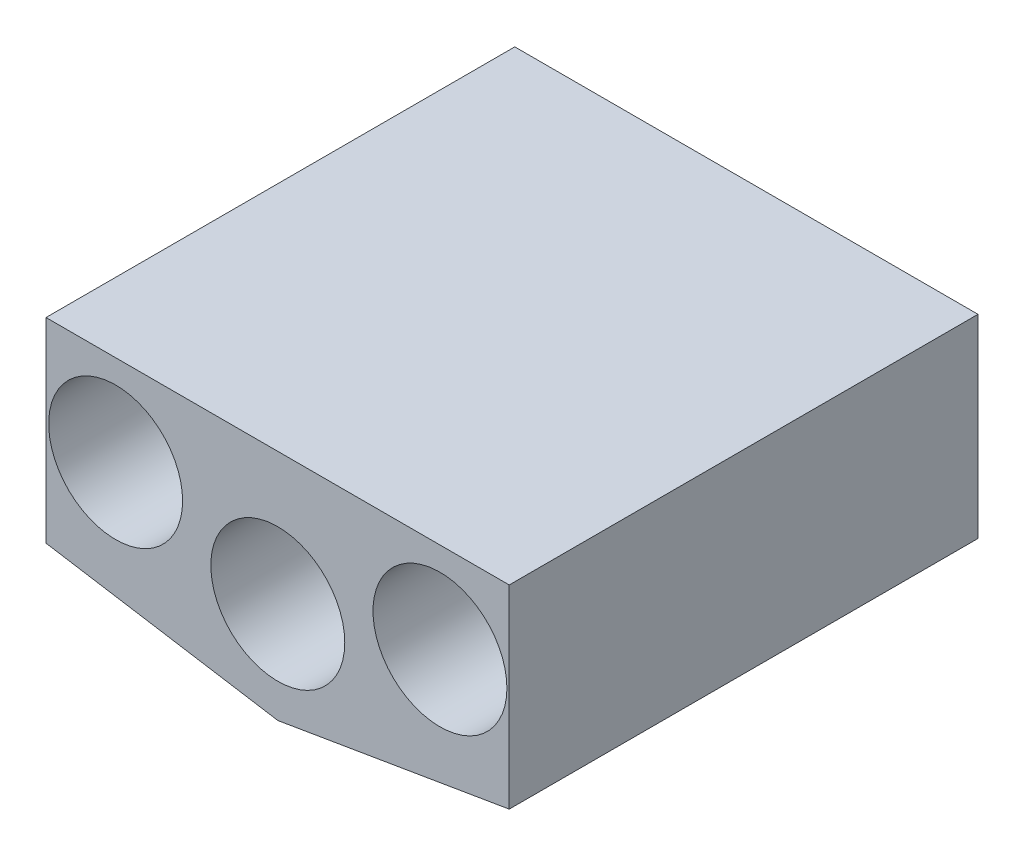
ISO-10303-21;
HEADER;
FILE_DESCRIPTION(('STEP AP214'),'2;1');
FILE_NAME('part.step','',(''),(''),'','','');
FILE_SCHEMA(('AUTOMOTIVE_DESIGN { 1 0 10303 214 1 1 1 1 }'));
ENDSEC;
DATA;
#1=APPLICATION_CONTEXT('core data for automotive mechanical design processes');
#2=APPLICATION_PROTOCOL_DEFINITION('international standard','automotive_design',2000,#1);
#3=PRODUCT_CONTEXT('',#1,'mechanical');
#4=PRODUCT('Part','Part','',(#3));
#5=PRODUCT_RELATED_PRODUCT_CATEGORY('part','',(#4));
#6=PRODUCT_DEFINITION_FORMATION('','',#4);
#7=PRODUCT_DEFINITION_CONTEXT('part definition',#1,'design');
#8=PRODUCT_DEFINITION('design','',#6,#7);
#9=PRODUCT_DEFINITION_SHAPE('','',#8);
#10=(LENGTH_UNIT() NAMED_UNIT(*) SI_UNIT(.MILLI.,.METRE.));
#11=(NAMED_UNIT(*) PLANE_ANGLE_UNIT() SI_UNIT($,.RADIAN.));
#12=(NAMED_UNIT(*) SI_UNIT($,.STERADIAN.) SOLID_ANGLE_UNIT());
#13=UNCERTAINTY_MEASURE_WITH_UNIT(LENGTH_MEASURE(1.E-05),#10,'distance_accuracy_value','');
#14=(GEOMETRIC_REPRESENTATION_CONTEXT(3) GLOBAL_UNCERTAINTY_ASSIGNED_CONTEXT((#13)) GLOBAL_UNIT_ASSIGNED_CONTEXT((#10,
#11,#12)) REPRESENTATION_CONTEXT('',''));
#15=CARTESIAN_POINT('',(0.,0.,0.));
#16=DIRECTION('',(0.,0.,1.));
#17=DIRECTION('',(1.,0.,0.));
#18=AXIS2_PLACEMENT_3D('',#15,#16,#17);
#19=CARTESIAN_POINT('',(0.,0.,70.));
#20=DIRECTION('',(0.,0.,1.));
#21=DIRECTION('',(1.,0.,0.));
#22=AXIS2_PLACEMENT_3D('',#19,#20,#21);
#23=PLANE('',#22);
#24=CARTESIAN_POINT('',(0.,0.,70.));
#25=DIRECTION('',(0.,0.,1.));
#26=DIRECTION('',(1.,0.,0.));
#27=AXIS2_PLACEMENT_3D('',#24,#25,#26);
#28=CIRCLE('',#27,10.);
#29=CARTESIAN_POINT('',(10.,0.,70.));
#30=VERTEX_POINT('',#29);
#31=EDGE_CURVE('E183',#30,#30,#28,.T.);
#32=ORIENTED_EDGE('',*,*,#31,.F.);
#33=EDGE_LOOP('',(#32));
#34=FACE_BOUND('',#33,.T.);
#35=DIRECTION('',(0.,1.,0.));
#36=VECTOR('',#35,1.);
#37=CARTESIAN_POINT('',(34.5580000783424,19.7407124290294,70.));
#38=LINE('',#37,#36);
#39=CARTESIAN_POINT('',(34.5580000783424,-9.25315364567469,70.));
#40=VERTEX_POINT('',#39);
#41=CARTESIAN_POINT('',(34.5580000783424,19.7407124290294,70.));
#42=VERTEX_POINT('',#41);
#43=EDGE_CURVE('E116',#40,#42,#38,.T.);
#44=ORIENTED_EDGE('',*,*,#43,.T.);
#45=DIRECTION('',(-1.,0.,0.));
#46=VECTOR('',#45,1.);
#47=CARTESIAN_POINT('',(-34.6119999216576,19.7407124290294,70.));
#48=LINE('',#47,#46);
#49=CARTESIAN_POINT('',(-34.6119999216576,19.7407124290294,70.));
#50=VERTEX_POINT('',#49);
#51=EDGE_CURVE('E83',#42,#50,#48,.T.);
#52=ORIENTED_EDGE('',*,*,#51,.T.);
#53=DIRECTION('',(0.,-1.,0.));
#54=VECTOR('',#53,1.);
#55=CARTESIAN_POINT('',(-34.6119999216576,-9.44415000475836,70.));
#56=LINE('',#55,#54);
#57=CARTESIAN_POINT('',(-34.6119999216576,-9.44415000475836,70.));
#58=VERTEX_POINT('',#57);
#59=EDGE_CURVE('E87',#50,#58,#56,.T.);
#60=ORIENTED_EDGE('',*,*,#59,.T.);
#61=DIRECTION('',(0.987066664055254,-0.16031032627636,0.));
#62=VECTOR('',#61,1.);
#63=CARTESIAN_POINT('',(-34.6119999216576,-9.44415000475836,70.));
#64=LINE('',#63,#62);
#65=CARTESIAN_POINT('',(0.0146025416581722,-15.0678856052803,70.));
#66=VERTEX_POINT('',#65);
#67=EDGE_CURVE('E91',#58,#66,#64,.T.);
#68=ORIENTED_EDGE('',*,*,#67,.T.);
#69=DIRECTION('',(0.98612644952598,0.165995860024531,0.));
#70=VECTOR('',#69,1.);
#71=CARTESIAN_POINT('',(34.5580000783424,-9.25315364567469,70.));
#72=LINE('',#71,#70);
#73=EDGE_CURVE('E49',#66,#40,#72,.T.);
#74=ORIENTED_EDGE('',*,*,#73,.T.);
#75=EDGE_LOOP('',(#44,#52,#60,#68,#74));
#76=FACE_BOUND('',#75,.T.);
#77=CARTESIAN_POINT('',(-24.2145790282158,6.21724717912147,70.));
#78=DIRECTION('',(0.,0.,1.));
#79=DIRECTION('',(1.,0.,0.));
#80=AXIS2_PLACEMENT_3D('',#77,#78,#79);
#81=CIRCLE('',#80,10.);
#82=CARTESIAN_POINT('',(-14.2145790282157,6.21724717912147,70.));
#83=VERTEX_POINT('',#82);
#84=EDGE_CURVE('E111',#83,#83,#81,.T.);
#85=ORIENTED_EDGE('',*,*,#84,.F.);
#86=EDGE_LOOP('',(#85));
#87=FACE_BOUND('',#86,.T.);
#88=CARTESIAN_POINT('',(24.2145790282158,6.21724717912114,70.));
#89=DIRECTION('',(0.,0.,1.));
#90=DIRECTION('',(1.,0.,0.));
#91=AXIS2_PLACEMENT_3D('',#88,#89,#90);
#92=CIRCLE('',#91,9.99999999999999);
#93=CARTESIAN_POINT('',(34.2145790282158,6.21724717912114,70.));
#94=VERTEX_POINT('',#93);
#95=EDGE_CURVE('E175',#94,#94,#92,.T.);
#96=ORIENTED_EDGE('',*,*,#95,.F.);
#97=EDGE_LOOP('',(#96));
#98=FACE_BOUND('',#97,.T.);
#99=ADVANCED_FACE('F32',(#34,#76,#87,#98),#23,.T.);
#100=CARTESIAN_POINT('',(0.,0.,0.));
#101=DIRECTION('',(0.,0.,1.));
#102=DIRECTION('',(1.,0.,0.));
#103=AXIS2_PLACEMENT_3D('',#100,#101,#102);
#104=PLANE('',#103);
#105=DIRECTION('',(0.,1.,0.));
#106=VECTOR('',#105,1.);
#107=CARTESIAN_POINT('',(34.5580000783424,19.7407124290294,0.));
#108=LINE('',#107,#106);
#109=CARTESIAN_POINT('',(34.5580000783424,-9.25315364567469,0.));
#110=VERTEX_POINT('',#109);
#111=CARTESIAN_POINT('',(34.5580000783424,19.7407124290294,0.));
#112=VERTEX_POINT('',#111);
#113=EDGE_CURVE('E107',#110,#112,#108,.T.);
#114=ORIENTED_EDGE('',*,*,#113,.F.);
#115=DIRECTION('',(0.98612644952598,0.165995860024531,0.));
#116=VECTOR('',#115,1.);
#117=CARTESIAN_POINT('',(34.5580000783424,-9.25315364567469,0.));
#118=LINE('',#117,#116);
#119=CARTESIAN_POINT('',(0.0146025416581722,-15.0678856052803,0.));
#120=VERTEX_POINT('',#119);
#121=EDGE_CURVE('E75',#120,#110,#118,.T.);
#122=ORIENTED_EDGE('',*,*,#121,.F.);
#123=DIRECTION('',(0.987066664055254,-0.16031032627636,0.));
#124=VECTOR('',#123,1.);
#125=CARTESIAN_POINT('',(-34.6119999216576,-9.44415000475836,0.));
#126=LINE('',#125,#124);
#127=CARTESIAN_POINT('',(-34.6119999216576,-9.44415000475836,0.));
#128=VERTEX_POINT('',#127);
#129=EDGE_CURVE('E69',#128,#120,#126,.T.);
#130=ORIENTED_EDGE('',*,*,#129,.F.);
#131=DIRECTION('',(0.,-1.,0.));
#132=VECTOR('',#131,1.);
#133=CARTESIAN_POINT('',(-34.6119999216576,-9.44415000475836,0.));
#134=LINE('',#133,#132);
#135=CARTESIAN_POINT('',(-34.6119999216576,19.7407124290294,0.));
#136=VERTEX_POINT('',#135);
#137=EDGE_CURVE('E98',#136,#128,#134,.T.);
#138=ORIENTED_EDGE('',*,*,#137,.F.);
#139=DIRECTION('',(-1.,0.,0.));
#140=VECTOR('',#139,1.);
#141=CARTESIAN_POINT('',(-34.6119999216576,19.7407124290294,0.));
#142=LINE('',#141,#140);
#143=EDGE_CURVE('E110',#112,#136,#142,.T.);
#144=ORIENTED_EDGE('',*,*,#143,.F.);
#145=EDGE_LOOP('',(#114,#122,#130,#138,#144));
#146=FACE_BOUND('',#145,.T.);
#147=CARTESIAN_POINT('',(-24.2145790282158,6.21724717912147,0.));
#148=DIRECTION('',(0.,0.,1.));
#149=DIRECTION('',(1.,0.,0.));
#150=AXIS2_PLACEMENT_3D('',#147,#148,#149);
#151=CIRCLE('',#150,10.);
#152=CARTESIAN_POINT('',(-14.2145790282157,6.21724717912147,0.));
#153=VERTEX_POINT('',#152);
#154=EDGE_CURVE('E186',#153,#153,#151,.T.);
#155=ORIENTED_EDGE('',*,*,#154,.T.);
#156=EDGE_LOOP('',(#155));
#157=FACE_BOUND('',#156,.T.);
#158=CARTESIAN_POINT('',(0.,0.,0.));
#159=DIRECTION('',(0.,0.,1.));
#160=DIRECTION('',(1.,0.,0.));
#161=AXIS2_PLACEMENT_3D('',#158,#159,#160);
#162=CIRCLE('',#161,10.);
#163=CARTESIAN_POINT('',(10.,0.,0.));
#164=VERTEX_POINT('',#163);
#165=EDGE_CURVE('E178',#164,#164,#162,.T.);
#166=ORIENTED_EDGE('',*,*,#165,.T.);
#167=EDGE_LOOP('',(#166));
#168=FACE_BOUND('',#167,.T.);
#169=CARTESIAN_POINT('',(24.2145790282158,6.21724717912114,0.));
#170=DIRECTION('',(0.,0.,1.));
#171=DIRECTION('',(1.,0.,0.));
#172=AXIS2_PLACEMENT_3D('',#169,#170,#171);
#173=CIRCLE('',#172,9.99999999999999);
#174=CARTESIAN_POINT('',(34.2145790282158,6.21724717912114,0.));
#175=VERTEX_POINT('',#174);
#176=EDGE_CURVE('E179',#175,#175,#173,.T.);
#177=ORIENTED_EDGE('',*,*,#176,.T.);
#178=EDGE_LOOP('',(#177));
#179=FACE_BOUND('',#178,.T.);
#180=ADVANCED_FACE('F120',(#146,#157,#168,#179),#104,.F.);
#181=CARTESIAN_POINT('',(34.5580000783424,19.7407124290294,70.));
#182=DIRECTION('',(-1.,0.,0.));
#183=DIRECTION('',(0.,0.,1.));
#184=AXIS2_PLACEMENT_3D('',#181,#182,#183);
#185=PLANE('',#184);
#186=ORIENTED_EDGE('',*,*,#113,.T.);
#187=DIRECTION('',(0.,0.,-1.));
#188=VECTOR('',#187,1.);
#189=CARTESIAN_POINT('',(34.5580000783424,19.7407124290294,70.));
#190=LINE('',#189,#188);
#191=EDGE_CURVE('E11',#42,#112,#190,.T.);
#192=ORIENTED_EDGE('',*,*,#191,.F.);
#193=ORIENTED_EDGE('',*,*,#43,.F.);
#194=DIRECTION('',(0.,0.,-1.));
#195=VECTOR('',#194,1.);
#196=CARTESIAN_POINT('',(34.5580000783424,-9.25315364567469,70.));
#197=LINE('',#196,#195);
#198=EDGE_CURVE('E103',#40,#110,#197,.T.);
#199=ORIENTED_EDGE('',*,*,#198,.T.);
#200=EDGE_LOOP('',(#186,#192,#193,#199));
#201=FACE_BOUND('',#200,.T.);
#202=ADVANCED_FACE('F34',(#201),#185,.F.);
#203=CARTESIAN_POINT('',(-34.6119999216576,19.7407124290294,70.));
#204=DIRECTION('',(0.,-1.,0.));
#205=DIRECTION('',(0.,0.,-1.));
#206=AXIS2_PLACEMENT_3D('',#203,#204,#205);
#207=PLANE('',#206);
#208=ORIENTED_EDGE('',*,*,#143,.T.);
#209=DIRECTION('',(0.,0.,-1.));
#210=VECTOR('',#209,1.);
#211=CARTESIAN_POINT('',(-34.6119999216576,19.7407124290294,70.));
#212=LINE('',#211,#210);
#213=EDGE_CURVE('E41',#50,#136,#212,.T.);
#214=ORIENTED_EDGE('',*,*,#213,.F.);
#215=ORIENTED_EDGE('',*,*,#51,.F.);
#216=ORIENTED_EDGE('',*,*,#191,.T.);
#217=EDGE_LOOP('',(#208,#214,#215,#216));
#218=FACE_BOUND('',#217,.T.);
#219=ADVANCED_FACE('F300',(#218),#207,.F.);
#220=CARTESIAN_POINT('',(-34.6119999216576,-9.44415000475836,70.));
#221=DIRECTION('',(1.,0.,0.));
#222=DIRECTION('',(0.,0.,-1.));
#223=AXIS2_PLACEMENT_3D('',#220,#221,#222);
#224=PLANE('',#223);
#225=ORIENTED_EDGE('',*,*,#137,.T.);
#226=DIRECTION('',(0.,0.,-1.));
#227=VECTOR('',#226,1.);
#228=CARTESIAN_POINT('',(-34.6119999216576,-9.44415000475836,70.));
#229=LINE('',#228,#227);
#230=EDGE_CURVE('E95',#58,#128,#229,.T.);
#231=ORIENTED_EDGE('',*,*,#230,.F.);
#232=ORIENTED_EDGE('',*,*,#59,.F.);
#233=ORIENTED_EDGE('',*,*,#213,.T.);
#234=EDGE_LOOP('',(#225,#231,#232,#233));
#235=FACE_BOUND('',#234,.T.);
#236=ADVANCED_FACE('F96',(#235),#224,.F.);
#237=CARTESIAN_POINT('',(-34.6119999216576,-9.44415000475836,70.));
#238=DIRECTION('',(0.16031032627636,0.987066664055254,0.));
#239=DIRECTION('',(-0.987066664055254,0.16031032627636,0.));
#240=AXIS2_PLACEMENT_3D('',#237,#238,#239);
#241=PLANE('',#240);
#242=CARTESIAN_POINT('',(-12.896533312442,-12.9709771828383,60.));
#243=DIRECTION('',(-0.16031032627636,-0.987066664055254,0.));
#244=DIRECTION('',(0.987066664055254,-0.16031032627636,0.));
#245=AXIS2_PLACEMENT_3D('',#242,#243,#244);
#246=CIRCLE('',#245,2.9);
#247=CARTESIAN_POINT('',(-10.0340399866818,-13.4358771290397,60.));
#248=VERTEX_POINT('',#247);
#249=EDGE_CURVE('E169',#248,#248,#246,.T.);
#250=ORIENTED_EDGE('',*,*,#249,.F.);
#251=EDGE_LOOP('',(#250));
#252=FACE_BOUND('',#251,.T.);
#253=CARTESIAN_POINT('',(-12.896533312442,-12.9709771828383,10.));
#254=DIRECTION('',(-0.16031032627636,-0.987066664055254,0.));
#255=DIRECTION('',(0.987066664055254,-0.16031032627636,0.));
#256=AXIS2_PLACEMENT_3D('',#253,#254,#255);
#257=CIRCLE('',#256,2.9);
#258=CARTESIAN_POINT('',(-10.0340399866818,-13.4358771290397,10.));
#259=VERTEX_POINT('',#258);
#260=EDGE_CURVE('E170',#259,#259,#257,.T.);
#261=ORIENTED_EDGE('',*,*,#260,.F.);
#262=EDGE_LOOP('',(#261));
#263=FACE_BOUND('',#262,.T.);
#264=ORIENTED_EDGE('',*,*,#129,.T.);
#265=DIRECTION('',(0.,0.,-1.));
#266=VECTOR('',#265,1.);
#267=CARTESIAN_POINT('',(0.0146025416581722,-15.0678856052803,70.));
#268=LINE('',#267,#266);
#269=EDGE_CURVE('E99',#66,#120,#268,.T.);
#270=ORIENTED_EDGE('',*,*,#269,.F.);
#271=ORIENTED_EDGE('',*,*,#67,.F.);
#272=ORIENTED_EDGE('',*,*,#230,.T.);
#273=EDGE_LOOP('',(#264,#270,#271,#272));
#274=FACE_BOUND('',#273,.T.);
#275=ADVANCED_FACE('F101',(#252,#263,#274),#241,.F.);
#276=CARTESIAN_POINT('',(34.5580000783424,-9.25315364567469,70.));
#277=DIRECTION('',(-0.165995860024531,0.986126449525981,0.));
#278=DIRECTION('',(-0.986126449525981,-0.165995860024531,0.));
#279=AXIS2_PLACEMENT_3D('',#276,#277,#278);
#280=PLANE('',#279);
#281=CARTESIAN_POINT('',(12.8632181887708,-12.9050625662144,60.));
#282=DIRECTION('',(0.165995860024531,-0.986126449525981,0.));
#283=DIRECTION('',(0.986126449525981,0.165995860024531,0.));
#284=AXIS2_PLACEMENT_3D('',#281,#282,#283);
#285=CIRCLE('',#284,2.9);
#286=CARTESIAN_POINT('',(15.7229848923962,-12.4236745721432,60.));
#287=VERTEX_POINT('',#286);
#288=EDGE_CURVE('E229',#287,#287,#285,.T.);
#289=ORIENTED_EDGE('',*,*,#288,.F.);
#290=EDGE_LOOP('',(#289));
#291=FACE_BOUND('',#290,.T.);
#292=CARTESIAN_POINT('',(12.8632181887708,-12.9050625662144,10.));
#293=DIRECTION('',(0.165995860024531,-0.986126449525981,0.));
#294=DIRECTION('',(0.986126449525981,0.165995860024531,0.));
#295=AXIS2_PLACEMENT_3D('',#292,#293,#294);
#296=CIRCLE('',#295,2.9);
#297=CARTESIAN_POINT('',(15.7229848923962,-12.4236745721432,10.));
#298=VERTEX_POINT('',#297);
#299=EDGE_CURVE('E210',#298,#298,#296,.T.);
#300=ORIENTED_EDGE('',*,*,#299,.F.);
#301=EDGE_LOOP('',(#300));
#302=FACE_BOUND('',#301,.T.);
#303=ORIENTED_EDGE('',*,*,#121,.T.);
#304=ORIENTED_EDGE('',*,*,#198,.F.);
#305=ORIENTED_EDGE('',*,*,#73,.F.);
#306=ORIENTED_EDGE('',*,*,#269,.T.);
#307=EDGE_LOOP('',(#303,#304,#305,#306));
#308=FACE_BOUND('',#307,.T.);
#309=ADVANCED_FACE('F125',(#291,#302,#308),#280,.F.);
#310=CARTESIAN_POINT('',(-24.2145790282158,6.21724717912147,70.));
#311=DIRECTION('',(0.,0.,-1.));
#312=DIRECTION('',(-1.,0.,0.));
#313=AXIS2_PLACEMENT_3D('',#310,#311,#312);
#314=CYLINDRICAL_SURFACE('',#313,10.);
#315=ORIENTED_EDGE('',*,*,#84,.T.);
#316=EDGE_LOOP('',(#315));
#317=FACE_BOUND('',#316,.T.);
#318=ORIENTED_EDGE('',*,*,#154,.F.);
#319=EDGE_LOOP('',(#318));
#320=FACE_BOUND('',#319,.T.);
#321=ADVANCED_FACE('F127',(#317,#320),#314,.F.);
#322=CARTESIAN_POINT('',(0.,0.,70.));
#323=DIRECTION('',(0.,0.,-1.));
#324=DIRECTION('',(-1.,0.,0.));
#325=AXIS2_PLACEMENT_3D('',#322,#323,#324);
#326=CYLINDRICAL_SURFACE('',#325,10.);
#327=ORIENTED_EDGE('',*,*,#31,.T.);
#328=EDGE_LOOP('',(#327));
#329=FACE_BOUND('',#328,.T.);
#330=ORIENTED_EDGE('',*,*,#165,.F.);
#331=EDGE_LOOP('',(#330));
#332=FACE_BOUND('',#331,.T.);
#333=ADVANCED_FACE('F134',(#329,#332),#326,.F.);
#334=CARTESIAN_POINT('',(24.2145790282158,6.21724717912114,70.));
#335=DIRECTION('',(0.,0.,-1.));
#336=DIRECTION('',(-1.,0.,0.));
#337=AXIS2_PLACEMENT_3D('',#334,#335,#336);
#338=CYLINDRICAL_SURFACE('',#337,9.99999999999999);
#339=ORIENTED_EDGE('',*,*,#95,.T.);
#340=EDGE_LOOP('',(#339));
#341=FACE_BOUND('',#340,.T.);
#342=ORIENTED_EDGE('',*,*,#176,.F.);
#343=EDGE_LOOP('',(#342));
#344=FACE_BOUND('',#343,.T.);
#345=ADVANCED_FACE('F152',(#341,#344),#338,.F.);
#346=CARTESIAN_POINT('',(-12.896533312442,-2.9709771828383,10.));
#347=DIRECTION('',(-0.16031032627636,-0.987066664055254,0.));
#348=DIRECTION('',(0.987066664055254,-0.16031032627636,0.));
#349=AXIS2_PLACEMENT_3D('',#346,#347,#348);
#350=CIRCLE('',#349,2.9);
#351=DIRECTION('',(0.,-1.,0.));
#352=VECTOR('',#351,1.);
#353=SURFACE_OF_LINEAR_EXTRUSION('',#350,#352);
#354=CARTESIAN_POINT('',(-10.0340399866818,-3.43587712903974,10.));
#355=VERTEX_POINT('',#354);
#356=EDGE_CURVE('E164',#355,#355,#350,.T.);
#357=ORIENTED_EDGE('',*,*,#356,.F.);
#358=EDGE_LOOP('',(#357));
#359=FACE_BOUND('',#358,.T.);
#360=ORIENTED_EDGE('',*,*,#260,.T.);
#361=EDGE_LOOP('',(#360));
#362=FACE_BOUND('',#361,.T.);
#363=ADVANCED_FACE('F156',(#359,#362),#353,.F.);
#364=CARTESIAN_POINT('',(-12.896533312442,-2.9709771828383,10.));
#365=DIRECTION('',(-0.16031032627636,-0.987066664055254,0.));
#366=DIRECTION('',(0.987066664055254,-0.16031032627636,0.));
#367=AXIS2_PLACEMENT_3D('',#364,#365,#366);
#368=PLANE('',#367);
#369=ORIENTED_EDGE('',*,*,#356,.T.);
#370=EDGE_LOOP('',(#369));
#371=FACE_BOUND('',#370,.T.);
#372=ADVANCED_FACE('F161',(#371),#368,.T.);
#373=CARTESIAN_POINT('',(-12.896533312442,-2.9709771828383,60.));
#374=DIRECTION('',(-0.16031032627636,-0.987066664055254,0.));
#375=DIRECTION('',(0.987066664055254,-0.16031032627636,0.));
#376=AXIS2_PLACEMENT_3D('',#373,#374,#375);
#377=CIRCLE('',#376,2.9);
#378=DIRECTION('',(0.,-1.,0.));
#379=VECTOR('',#378,1.);
#380=SURFACE_OF_LINEAR_EXTRUSION('',#377,#379);
#381=CARTESIAN_POINT('',(-10.0340399866818,-3.43587712903974,60.));
#382=VERTEX_POINT('',#381);
#383=EDGE_CURVE('E182',#382,#382,#377,.T.);
#384=ORIENTED_EDGE('',*,*,#383,.F.);
#385=EDGE_LOOP('',(#384));
#386=FACE_BOUND('',#385,.T.);
#387=ORIENTED_EDGE('',*,*,#249,.T.);
#388=EDGE_LOOP('',(#387));
#389=FACE_BOUND('',#388,.T.);
#390=ADVANCED_FACE('F212',(#386,#389),#380,.F.);
#391=CARTESIAN_POINT('',(-12.896533312442,-2.9709771828383,60.));
#392=DIRECTION('',(-0.16031032627636,-0.987066664055254,0.));
#393=DIRECTION('',(0.987066664055254,-0.16031032627636,0.));
#394=AXIS2_PLACEMENT_3D('',#391,#392,#393);
#395=PLANE('',#394);
#396=ORIENTED_EDGE('',*,*,#383,.T.);
#397=EDGE_LOOP('',(#396));
#398=FACE_BOUND('',#397,.T.);
#399=ADVANCED_FACE('F215',(#398),#395,.T.);
#400=CARTESIAN_POINT('',(12.8632181887708,-2.90506256621436,10.));
#401=DIRECTION('',(0.165995860024531,-0.986126449525981,0.));
#402=DIRECTION('',(0.986126449525981,0.165995860024531,0.));
#403=AXIS2_PLACEMENT_3D('',#400,#401,#402);
#404=CIRCLE('',#403,2.9);
#405=DIRECTION('',(0.,-1.,0.));
#406=VECTOR('',#405,1.);
#407=SURFACE_OF_LINEAR_EXTRUSION('',#404,#406);
#408=CARTESIAN_POINT('',(15.7229848923962,-2.42367457214322,10.));
#409=VERTEX_POINT('',#408);
#410=EDGE_CURVE('E225',#409,#409,#404,.T.);
#411=ORIENTED_EDGE('',*,*,#410,.F.);
#412=EDGE_LOOP('',(#411));
#413=FACE_BOUND('',#412,.T.);
#414=ORIENTED_EDGE('',*,*,#299,.T.);
#415=EDGE_LOOP('',(#414));
#416=FACE_BOUND('',#415,.T.);
#417=ADVANCED_FACE('F219',(#413,#416),#407,.F.);
#418=CARTESIAN_POINT('',(12.8632181887708,-2.90506256621436,10.));
#419=DIRECTION('',(0.165995860024531,-0.986126449525981,0.));
#420=DIRECTION('',(0.986126449525981,0.165995860024531,0.));
#421=AXIS2_PLACEMENT_3D('',#418,#419,#420);
#422=PLANE('',#421);
#423=ORIENTED_EDGE('',*,*,#410,.T.);
#424=EDGE_LOOP('',(#423));
#425=FACE_BOUND('',#424,.T.);
#426=ADVANCED_FACE('F222',(#425),#422,.T.);
#427=CARTESIAN_POINT('',(12.8632181887708,-2.90506256621436,60.));
#428=DIRECTION('',(0.165995860024531,-0.986126449525981,0.));
#429=DIRECTION('',(0.986126449525981,0.165995860024531,0.));
#430=AXIS2_PLACEMENT_3D('',#427,#428,#429);
#431=CIRCLE('',#430,2.9);
#432=DIRECTION('',(0.,-1.,0.));
#433=VECTOR('',#432,1.);
#434=SURFACE_OF_LINEAR_EXTRUSION('',#431,#433);
#435=CARTESIAN_POINT('',(15.7229848923962,-2.42367457214322,60.));
#436=VERTEX_POINT('',#435);
#437=EDGE_CURVE('E174',#436,#436,#431,.T.);
#438=ORIENTED_EDGE('',*,*,#437,.F.);
#439=EDGE_LOOP('',(#438));
#440=FACE_BOUND('',#439,.T.);
#441=ORIENTED_EDGE('',*,*,#288,.T.);
#442=EDGE_LOOP('',(#441));
#443=FACE_BOUND('',#442,.T.);
#444=ADVANCED_FACE('F234',(#440,#443),#434,.F.);
#445=CARTESIAN_POINT('',(12.8632181887708,-2.90506256621436,60.));
#446=DIRECTION('',(0.165995860024531,-0.986126449525981,0.));
#447=DIRECTION('',(0.986126449525981,0.165995860024531,0.));
#448=AXIS2_PLACEMENT_3D('',#445,#446,#447);
#449=PLANE('',#448);
#450=ORIENTED_EDGE('',*,*,#437,.T.);
#451=EDGE_LOOP('',(#450));
#452=FACE_BOUND('',#451,.T.);
#453=ADVANCED_FACE('F237',(#452),#449,.T.);
#454=CLOSED_SHELL('',(#99,#180,#202,#219,#236,#275,#309,#321,#333,#345,#363,#372,#390,#399,#417,
#426,#444,#453));
#455=MANIFOLD_SOLID_BREP('B2',#454);
#456=ADVANCED_BREP_SHAPE_REPRESENTATION('',(#18,#455),#14);
#457=SHAPE_DEFINITION_REPRESENTATION(#9,#456);
ENDSEC;
END-ISO-10303-21;
